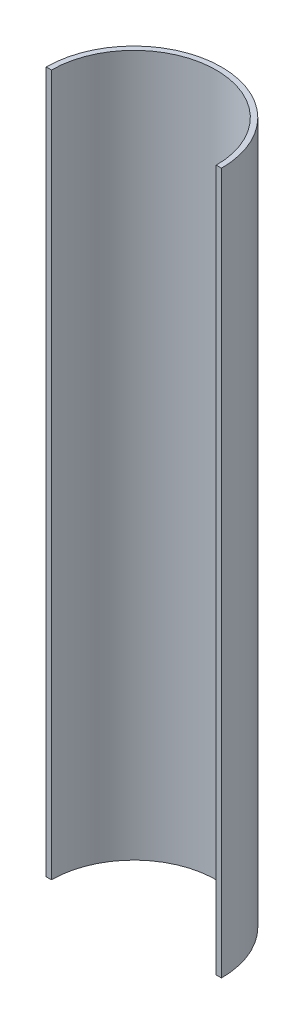
ISO-10303-21;
HEADER;
FILE_DESCRIPTION(('STEP AP214'),'2;1');
FILE_NAME('part.step','',(''),(''),'','','');
FILE_SCHEMA(('AUTOMOTIVE_DESIGN { 1 0 10303 214 1 1 1 1 }'));
ENDSEC;
DATA;
#1=APPLICATION_CONTEXT('core data for automotive mechanical design processes');
#2=APPLICATION_PROTOCOL_DEFINITION('international standard','automotive_design',2000,#1);
#3=PRODUCT_CONTEXT('',#1,'mechanical');
#4=PRODUCT('Part','Part','',(#3));
#5=PRODUCT_RELATED_PRODUCT_CATEGORY('part','',(#4));
#6=PRODUCT_DEFINITION_FORMATION('','',#4);
#7=PRODUCT_DEFINITION_CONTEXT('part definition',#1,'design');
#8=PRODUCT_DEFINITION('design','',#6,#7);
#9=PRODUCT_DEFINITION_SHAPE('','',#8);
#10=(LENGTH_UNIT() NAMED_UNIT(*) SI_UNIT(.MILLI.,.METRE.));
#11=(NAMED_UNIT(*) PLANE_ANGLE_UNIT() SI_UNIT($,.RADIAN.));
#12=(NAMED_UNIT(*) SI_UNIT($,.STERADIAN.) SOLID_ANGLE_UNIT());
#13=UNCERTAINTY_MEASURE_WITH_UNIT(LENGTH_MEASURE(1.E-05),#10,'distance_accuracy_value','');
#14=(GEOMETRIC_REPRESENTATION_CONTEXT(3) GLOBAL_UNCERTAINTY_ASSIGNED_CONTEXT((#13)) GLOBAL_UNIT_ASSIGNED_CONTEXT((#10,
#11,#12)) REPRESENTATION_CONTEXT('',''));
#15=CARTESIAN_POINT('',(0.,0.,0.));
#16=DIRECTION('',(0.,0.,1.));
#17=DIRECTION('',(1.,0.,0.));
#18=AXIS2_PLACEMENT_3D('',#15,#16,#17);
#19=CARTESIAN_POINT('',(48.5,400.,0.));
#20=DIRECTION('',(0.,-1.,0.));
#21=DIRECTION('',(0.,0.,-1.));
#22=AXIS2_PLACEMENT_3D('',#19,#20,#21);
#23=CYLINDRICAL_SURFACE('',#22,47.);
#24=CARTESIAN_POINT('',(48.5,0.,0.));
#25=DIRECTION('',(0.,1.,0.));
#26=DIRECTION('',(0.,0.,1.));
#27=AXIS2_PLACEMENT_3D('',#24,#25,#26);
#28=CIRCLE('',#27,47.);
#29=CARTESIAN_POINT('',(95.5,0.,0.));
#30=VERTEX_POINT('',#29);
#31=CARTESIAN_POINT('',(1.50000000000001,0.,3.27634620098408E-13));
#32=VERTEX_POINT('',#31);
#33=EDGE_CURVE('E97',#30,#32,#28,.T.);
#34=ORIENTED_EDGE('',*,*,#33,.F.);
#35=DIRECTION('',(0.,-1.,0.));
#36=VECTOR('',#35,1.);
#37=CARTESIAN_POINT('',(95.5,400.,0.));
#38=LINE('',#37,#36);
#39=CARTESIAN_POINT('',(95.5,400.,0.));
#40=VERTEX_POINT('',#39);
#41=EDGE_CURVE('E11',#40,#30,#38,.T.);
#42=ORIENTED_EDGE('',*,*,#41,.F.);
#43=CARTESIAN_POINT('',(48.5,400.,0.));
#44=DIRECTION('',(0.,1.,0.));
#45=DIRECTION('',(0.,0.,1.));
#46=AXIS2_PLACEMENT_3D('',#43,#44,#45);
#47=CIRCLE('',#46,47.);
#48=CARTESIAN_POINT('',(1.50000000000001,400.,3.27634620098408E-13));
#49=VERTEX_POINT('',#48);
#50=EDGE_CURVE('E85',#40,#49,#47,.T.);
#51=ORIENTED_EDGE('',*,*,#50,.T.);
#52=DIRECTION('',(0.,-1.,0.));
#53=VECTOR('',#52,1.);
#54=CARTESIAN_POINT('',(1.50000000000001,400.,3.27634620098408E-13));
#55=LINE('',#54,#53);
#56=EDGE_CURVE('E74',#49,#32,#55,.T.);
#57=ORIENTED_EDGE('',*,*,#56,.T.);
#58=EDGE_LOOP('',(#34,#42,#51,#57));
#59=FACE_BOUND('',#58,.T.);
#60=ADVANCED_FACE('F35',(#59),#23,.F.);
#61=CARTESIAN_POINT('',(0.,400.,-4.91928425068346E-12));
#62=DIRECTION('',(0.,0.,-1.));
#63=DIRECTION('',(-1.,0.,0.));
#64=AXIS2_PLACEMENT_3D('',#61,#62,#63);
#65=PLANE('',#64);
#66=DIRECTION('',(1.,0.,0.));
#67=VECTOR('',#66,1.);
#68=CARTESIAN_POINT('',(0.,0.,-4.91928425068346E-12));
#69=LINE('',#68,#67);
#70=CARTESIAN_POINT('',(98.5,0.,1.53950126862774E-13));
#71=VERTEX_POINT('',#70);
#72=EDGE_CURVE('E90',#30,#71,#69,.T.);
#73=ORIENTED_EDGE('',*,*,#72,.T.);
#74=DIRECTION('',(0.,-1.,0.));
#75=VECTOR('',#74,1.);
#76=CARTESIAN_POINT('',(98.5,400.,1.53950126862774E-13));
#77=LINE('',#76,#75);
#78=CARTESIAN_POINT('',(98.5,400.,1.53950126862774E-13));
#79=VERTEX_POINT('',#78);
#80=EDGE_CURVE('E43',#79,#71,#77,.T.);
#81=ORIENTED_EDGE('',*,*,#80,.F.);
#82=DIRECTION('',(1.,0.,0.));
#83=VECTOR('',#82,1.);
#84=CARTESIAN_POINT('',(0.,400.,-4.91928425068346E-12));
#85=LINE('',#84,#83);
#86=EDGE_CURVE('E80',#40,#79,#85,.T.);
#87=ORIENTED_EDGE('',*,*,#86,.F.);
#88=ORIENTED_EDGE('',*,*,#41,.T.);
#89=EDGE_LOOP('',(#73,#81,#87,#88));
#90=FACE_BOUND('',#89,.T.);
#91=ADVANCED_FACE('F88',(#90),#65,.F.);
#92=CARTESIAN_POINT('',(48.5,400.,0.));
#93=DIRECTION('',(0.,-1.,0.));
#94=DIRECTION('',(0.,0.,-1.));
#95=AXIS2_PLACEMENT_3D('',#92,#93,#94);
#96=CYLINDRICAL_SURFACE('',#95,50.);
#97=CARTESIAN_POINT('',(48.5,0.,0.));
#98=DIRECTION('',(0.,1.,0.));
#99=DIRECTION('',(0.,0.,1.));
#100=AXIS2_PLACEMENT_3D('',#97,#98,#99);
#101=CIRCLE('',#100,50.);
#102=CARTESIAN_POINT('',(-1.49999999999999,0.,3.48583508131466E-13));
#103=VERTEX_POINT('',#102);
#104=EDGE_CURVE('E67',#71,#103,#101,.T.);
#105=ORIENTED_EDGE('',*,*,#104,.T.);
#106=DIRECTION('',(0.,-1.,0.));
#107=VECTOR('',#106,1.);
#108=CARTESIAN_POINT('',(-1.49999999999999,400.,3.48583508131466E-13));
#109=LINE('',#108,#107);
#110=CARTESIAN_POINT('',(-1.49999999999999,400.,3.48583508131466E-13));
#111=VERTEX_POINT('',#110);
#112=EDGE_CURVE('E91',#111,#103,#109,.T.);
#113=ORIENTED_EDGE('',*,*,#112,.F.);
#114=CARTESIAN_POINT('',(48.5,400.,0.));
#115=DIRECTION('',(0.,1.,0.));
#116=DIRECTION('',(0.,0.,1.));
#117=AXIS2_PLACEMENT_3D('',#114,#115,#116);
#118=CIRCLE('',#117,50.);
#119=EDGE_CURVE('E84',#79,#111,#118,.T.);
#120=ORIENTED_EDGE('',*,*,#119,.F.);
#121=ORIENTED_EDGE('',*,*,#80,.T.);
#122=EDGE_LOOP('',(#105,#113,#120,#121));
#123=FACE_BOUND('',#122,.T.);
#124=ADVANCED_FACE('F92',(#123),#96,.T.);
#125=CARTESIAN_POINT('',(0.,400.,3.38109064114937E-13));
#126=DIRECTION('',(0.,0.,-1.));
#127=DIRECTION('',(-1.,0.,0.));
#128=AXIS2_PLACEMENT_3D('',#125,#126,#127);
#129=PLANE('',#128);
#130=DIRECTION('',(1.,0.,0.));
#131=VECTOR('',#130,1.);
#132=CARTESIAN_POINT('',(0.,0.,3.38109064114937E-13));
#133=LINE('',#132,#131);
#134=EDGE_CURVE('E102',#103,#32,#133,.T.);
#135=ORIENTED_EDGE('',*,*,#134,.T.);
#136=ORIENTED_EDGE('',*,*,#56,.F.);
#137=DIRECTION('',(1.,0.,0.));
#138=VECTOR('',#137,1.);
#139=CARTESIAN_POINT('',(0.,400.,3.38109064114937E-13));
#140=LINE('',#139,#138);
#141=EDGE_CURVE('E51',#111,#49,#140,.T.);
#142=ORIENTED_EDGE('',*,*,#141,.F.);
#143=ORIENTED_EDGE('',*,*,#112,.T.);
#144=EDGE_LOOP('',(#135,#136,#142,#143));
#145=FACE_BOUND('',#144,.T.);
#146=ADVANCED_FACE('F107',(#145),#129,.F.);
#147=CARTESIAN_POINT('',(0.,400.,0.));
#148=DIRECTION('',(0.,1.,0.));
#149=DIRECTION('',(0.,0.,1.));
#150=AXIS2_PLACEMENT_3D('',#147,#148,#149);
#151=PLANE('',#150);
#152=ORIENTED_EDGE('',*,*,#50,.F.);
#153=ORIENTED_EDGE('',*,*,#86,.T.);
#154=ORIENTED_EDGE('',*,*,#119,.T.);
#155=ORIENTED_EDGE('',*,*,#141,.T.);
#156=EDGE_LOOP('',(#152,#153,#154,#155));
#157=FACE_BOUND('',#156,.T.);
#158=ADVANCED_FACE('F82',(#157),#151,.T.);
#159=CARTESIAN_POINT('',(0.,0.,0.));
#160=DIRECTION('',(0.,1.,0.));
#161=DIRECTION('',(0.,0.,1.));
#162=AXIS2_PLACEMENT_3D('',#159,#160,#161);
#163=PLANE('',#162);
#164=ORIENTED_EDGE('',*,*,#33,.T.);
#165=ORIENTED_EDGE('',*,*,#134,.F.);
#166=ORIENTED_EDGE('',*,*,#104,.F.);
#167=ORIENTED_EDGE('',*,*,#72,.F.);
#168=EDGE_LOOP('',(#164,#165,#166,#167));
#169=FACE_BOUND('',#168,.T.);
#170=ADVANCED_FACE('F109',(#169),#163,.F.);
#171=CLOSED_SHELL('',(#60,#91,#124,#146,#158,#170));
#172=MANIFOLD_SOLID_BREP('B2',#171);
#173=ADVANCED_BREP_SHAPE_REPRESENTATION('',(#18,#172),#14);
#174=SHAPE_DEFINITION_REPRESENTATION(#9,#173);
ENDSEC;
END-ISO-10303-21;
